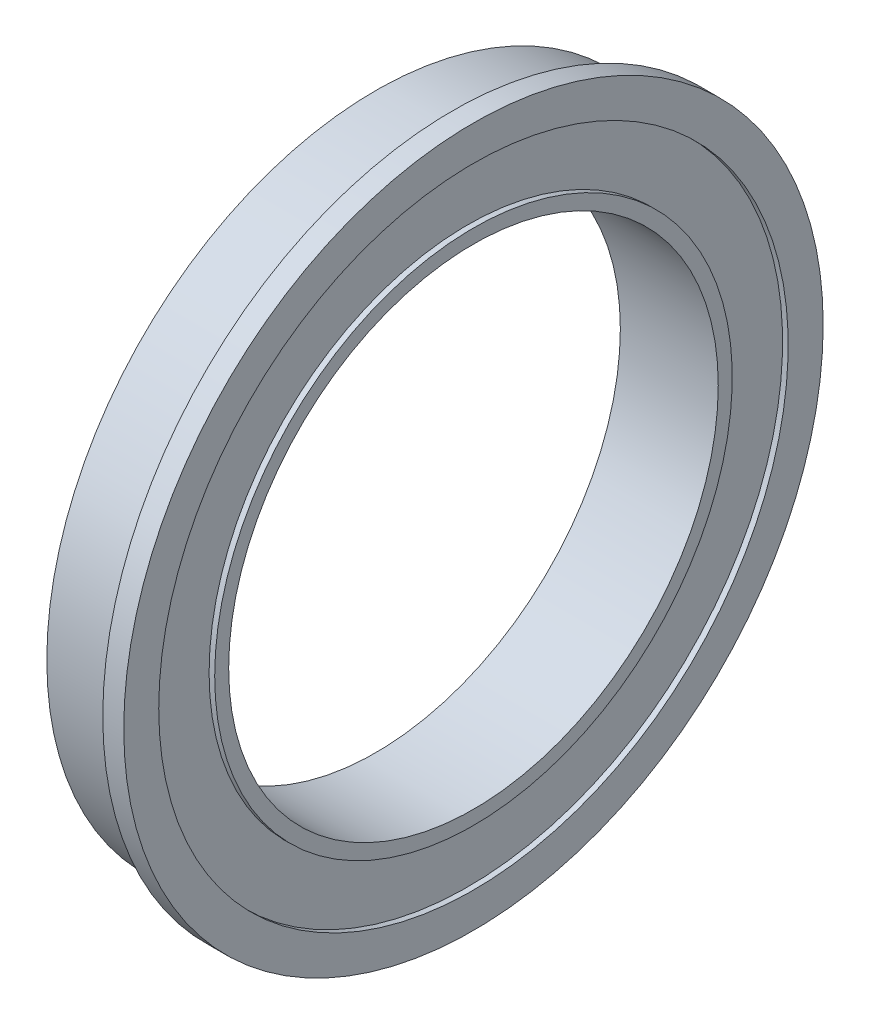
ISO-10303-21;
HEADER;
FILE_DESCRIPTION(('STEP AP214'),'2;1');
FILE_NAME('part.step','',(''),(''),'','','');
FILE_SCHEMA(('AUTOMOTIVE_DESIGN { 1 0 10303 214 1 1 1 1 }'));
ENDSEC;
DATA;
#1=APPLICATION_CONTEXT('core data for automotive mechanical design processes');
#2=APPLICATION_PROTOCOL_DEFINITION('international standard','automotive_design',2000,#1);
#3=PRODUCT_CONTEXT('',#1,'mechanical');
#4=PRODUCT('Part','Part','',(#3));
#5=PRODUCT_RELATED_PRODUCT_CATEGORY('part','',(#4));
#6=PRODUCT_DEFINITION_FORMATION('','',#4);
#7=PRODUCT_DEFINITION_CONTEXT('part definition',#1,'design');
#8=PRODUCT_DEFINITION('design','',#6,#7);
#9=PRODUCT_DEFINITION_SHAPE('','',#8);
#10=(LENGTH_UNIT() NAMED_UNIT(*) SI_UNIT(.MILLI.,.METRE.));
#11=(NAMED_UNIT(*) PLANE_ANGLE_UNIT() SI_UNIT($,.RADIAN.));
#12=(NAMED_UNIT(*) SI_UNIT($,.STERADIAN.) SOLID_ANGLE_UNIT());
#13=UNCERTAINTY_MEASURE_WITH_UNIT(LENGTH_MEASURE(1.E-05),#10,'distance_accuracy_value','');
#14=(GEOMETRIC_REPRESENTATION_CONTEXT(3) GLOBAL_UNCERTAINTY_ASSIGNED_CONTEXT((#13)) GLOBAL_UNIT_ASSIGNED_CONTEXT((#10,
#11,#12)) REPRESENTATION_CONTEXT('',''));
#15=CARTESIAN_POINT('',(0.,0.,0.));
#16=DIRECTION('',(0.,0.,1.));
#17=DIRECTION('',(1.,0.,0.));
#18=AXIS2_PLACEMENT_3D('',#15,#16,#17);
#19=CARTESIAN_POINT('',(5.5,23.5,0.));
#20=DIRECTION('',(1.,0.,0.));
#21=DIRECTION('',(0.,0.,-1.));
#22=AXIS2_PLACEMENT_3D('',#19,#20,#21);
#23=PLANE('',#22);
#24=CARTESIAN_POINT('',(5.5,0.,0.));
#25=DIRECTION('',(-1.,0.,0.));
#26=DIRECTION('',(0.,0.,1.));
#27=AXIS2_PLACEMENT_3D('',#24,#25,#26);
#28=CIRCLE('',#27,23.5);
#29=CARTESIAN_POINT('',(5.5,0.,23.5));
#30=VERTEX_POINT('',#29);
#31=EDGE_CURVE('E86',#30,#30,#28,.T.);
#32=ORIENTED_EDGE('',*,*,#31,.F.);
#33=EDGE_LOOP('',(#32));
#34=FACE_BOUND('',#33,.T.);
#35=CARTESIAN_POINT('',(5.5,0.,0.));
#36=DIRECTION('',(-1.,0.,0.));
#37=DIRECTION('',(0.,0.,1.));
#38=AXIS2_PLACEMENT_3D('',#35,#36,#37);
#39=CIRCLE('',#38,25.);
#40=CARTESIAN_POINT('',(5.5,0.,25.));
#41=VERTEX_POINT('',#40);
#42=EDGE_CURVE('E10',#41,#41,#39,.T.);
#43=ORIENTED_EDGE('',*,*,#42,.T.);
#44=EDGE_LOOP('',(#43));
#45=FACE_BOUND('',#44,.T.);
#46=ADVANCED_FACE('F40',(#34,#45),#23,.F.);
#47=CARTESIAN_POINT('',(0.,0.,0.));
#48=DIRECTION('',(-1.,0.,0.));
#49=DIRECTION('',(0.,0.,1.));
#50=AXIS2_PLACEMENT_3D('',#47,#48,#49);
#51=CYLINDRICAL_SURFACE('',#50,25.);
#52=ORIENTED_EDGE('',*,*,#42,.F.);
#53=EDGE_LOOP('',(#52));
#54=FACE_BOUND('',#53,.T.);
#55=CARTESIAN_POINT('',(7.,0.,0.));
#56=DIRECTION('',(-1.,0.,0.));
#57=DIRECTION('',(0.,0.,1.));
#58=AXIS2_PLACEMENT_3D('',#55,#56,#57);
#59=CIRCLE('',#58,25.);
#60=CARTESIAN_POINT('',(7.,0.,25.));
#61=VERTEX_POINT('',#60);
#62=EDGE_CURVE('E46',#61,#61,#59,.T.);
#63=ORIENTED_EDGE('',*,*,#62,.T.);
#64=EDGE_LOOP('',(#63));
#65=FACE_BOUND('',#64,.T.);
#66=ADVANCED_FACE('F93',(#54,#65),#51,.T.);
#67=CARTESIAN_POINT('',(7.,25.,0.));
#68=DIRECTION('',(-1.,0.,0.));
#69=DIRECTION('',(0.,0.,1.));
#70=AXIS2_PLACEMENT_3D('',#67,#68,#69);
#71=PLANE('',#70);
#72=ORIENTED_EDGE('',*,*,#62,.F.);
#73=EDGE_LOOP('',(#72));
#74=FACE_BOUND('',#73,.T.);
#75=CARTESIAN_POINT('',(7.,0.,0.));
#76=DIRECTION('',(-1.,0.,0.));
#77=DIRECTION('',(0.,0.,1.));
#78=AXIS2_PLACEMENT_3D('',#75,#76,#77);
#79=CIRCLE('',#78,22.5);
#80=CARTESIAN_POINT('',(7.,0.,22.5));
#81=VERTEX_POINT('',#80);
#82=EDGE_CURVE('E50',#81,#81,#79,.T.);
#83=ORIENTED_EDGE('',*,*,#82,.T.);
#84=EDGE_LOOP('',(#83));
#85=FACE_BOUND('',#84,.T.);
#86=ADVANCED_FACE('F97',(#74,#85),#71,.F.);
#87=CARTESIAN_POINT('',(0.,0.,0.));
#88=DIRECTION('',(-1.,0.,0.));
#89=DIRECTION('',(0.,0.,1.));
#90=AXIS2_PLACEMENT_3D('',#87,#88,#89);
#91=CYLINDRICAL_SURFACE('',#90,22.5);
#92=ORIENTED_EDGE('',*,*,#82,.F.);
#93=EDGE_LOOP('',(#92));
#94=FACE_BOUND('',#93,.T.);
#95=CARTESIAN_POINT('',(6.6,0.,0.));
#96=DIRECTION('',(-1.,0.,0.));
#97=DIRECTION('',(0.,0.,1.));
#98=AXIS2_PLACEMENT_3D('',#95,#96,#97);
#99=CIRCLE('',#98,22.5);
#100=CARTESIAN_POINT('',(6.6,0.,22.5));
#101=VERTEX_POINT('',#100);
#102=EDGE_CURVE('E54',#101,#101,#99,.T.);
#103=ORIENTED_EDGE('',*,*,#102,.T.);
#104=EDGE_LOOP('',(#103));
#105=FACE_BOUND('',#104,.T.);
#106=ADVANCED_FACE('F102',(#94,#105),#91,.F.);
#107=CARTESIAN_POINT('',(6.6,22.5,0.));
#108=DIRECTION('',(-1.,0.,0.));
#109=DIRECTION('',(0.,0.,1.));
#110=AXIS2_PLACEMENT_3D('',#107,#108,#109);
#111=PLANE('',#110);
#112=ORIENTED_EDGE('',*,*,#102,.F.);
#113=EDGE_LOOP('',(#112));
#114=FACE_BOUND('',#113,.T.);
#115=CARTESIAN_POINT('',(6.6,0.,0.));
#116=DIRECTION('',(-1.,0.,0.));
#117=DIRECTION('',(0.,0.,1.));
#118=AXIS2_PLACEMENT_3D('',#115,#116,#117);
#119=CIRCLE('',#118,18.5);
#120=CARTESIAN_POINT('',(6.6,0.,18.5));
#121=VERTEX_POINT('',#120);
#122=EDGE_CURVE('E59',#121,#121,#119,.T.);
#123=ORIENTED_EDGE('',*,*,#122,.T.);
#124=EDGE_LOOP('',(#123));
#125=FACE_BOUND('',#124,.T.);
#126=ADVANCED_FACE('F108',(#114,#125),#111,.F.);
#127=CARTESIAN_POINT('',(0.,0.,0.));
#128=DIRECTION('',(-1.,0.,0.));
#129=DIRECTION('',(0.,0.,1.));
#130=AXIS2_PLACEMENT_3D('',#127,#128,#129);
#131=CYLINDRICAL_SURFACE('',#130,18.5);
#132=ORIENTED_EDGE('',*,*,#122,.F.);
#133=EDGE_LOOP('',(#132));
#134=FACE_BOUND('',#133,.T.);
#135=CARTESIAN_POINT('',(7.,0.,0.));
#136=DIRECTION('',(-1.,0.,0.));
#137=DIRECTION('',(0.,0.,1.));
#138=AXIS2_PLACEMENT_3D('',#135,#136,#137);
#139=CIRCLE('',#138,18.5);
#140=CARTESIAN_POINT('',(7.,0.,18.5));
#141=VERTEX_POINT('',#140);
#142=EDGE_CURVE('E62',#141,#141,#139,.T.);
#143=ORIENTED_EDGE('',*,*,#142,.T.);
#144=EDGE_LOOP('',(#143));
#145=FACE_BOUND('',#144,.T.);
#146=ADVANCED_FACE('F112',(#134,#145),#131,.T.);
#147=CARTESIAN_POINT('',(7.,18.5,0.));
#148=DIRECTION('',(-1.,0.,0.));
#149=DIRECTION('',(0.,0.,1.));
#150=AXIS2_PLACEMENT_3D('',#147,#148,#149);
#151=PLANE('',#150);
#152=ORIENTED_EDGE('',*,*,#142,.F.);
#153=EDGE_LOOP('',(#152));
#154=FACE_BOUND('',#153,.T.);
#155=CARTESIAN_POINT('',(7.,0.,0.));
#156=DIRECTION('',(-1.,0.,0.));
#157=DIRECTION('',(0.,0.,1.));
#158=AXIS2_PLACEMENT_3D('',#155,#156,#157);
#159=CIRCLE('',#158,17.5);
#160=CARTESIAN_POINT('',(7.,0.,17.5));
#161=VERTEX_POINT('',#160);
#162=EDGE_CURVE('E65',#161,#161,#159,.T.);
#163=ORIENTED_EDGE('',*,*,#162,.T.);
#164=EDGE_LOOP('',(#163));
#165=FACE_BOUND('',#164,.T.);
#166=ADVANCED_FACE('F116',(#154,#165),#151,.F.);
#167=CARTESIAN_POINT('',(0.,0.,0.));
#168=DIRECTION('',(-1.,0.,0.));
#169=DIRECTION('',(0.,0.,1.));
#170=AXIS2_PLACEMENT_3D('',#167,#168,#169);
#171=CYLINDRICAL_SURFACE('',#170,17.5);
#172=ORIENTED_EDGE('',*,*,#162,.F.);
#173=EDGE_LOOP('',(#172));
#174=FACE_BOUND('',#173,.T.);
#175=CARTESIAN_POINT('',(0.,0.,0.));
#176=DIRECTION('',(-1.,0.,0.));
#177=DIRECTION('',(0.,0.,1.));
#178=AXIS2_PLACEMENT_3D('',#175,#176,#177);
#179=CIRCLE('',#178,17.5);
#180=CARTESIAN_POINT('',(0.,0.,17.5));
#181=VERTEX_POINT('',#180);
#182=EDGE_CURVE('E68',#181,#181,#179,.T.);
#183=ORIENTED_EDGE('',*,*,#182,.T.);
#184=EDGE_LOOP('',(#183));
#185=FACE_BOUND('',#184,.T.);
#186=ADVANCED_FACE('F120',(#174,#185),#171,.F.);
#187=CARTESIAN_POINT('',(0.,17.5,0.));
#188=DIRECTION('',(1.,0.,0.));
#189=DIRECTION('',(0.,0.,-1.));
#190=AXIS2_PLACEMENT_3D('',#187,#188,#189);
#191=PLANE('',#190);
#192=ORIENTED_EDGE('',*,*,#182,.F.);
#193=EDGE_LOOP('',(#192));
#194=FACE_BOUND('',#193,.T.);
#195=CARTESIAN_POINT('',(0.,0.,0.));
#196=DIRECTION('',(-1.,0.,0.));
#197=DIRECTION('',(0.,0.,1.));
#198=AXIS2_PLACEMENT_3D('',#195,#196,#197);
#199=CIRCLE('',#198,18.5);
#200=CARTESIAN_POINT('',(0.,0.,18.5));
#201=VERTEX_POINT('',#200);
#202=EDGE_CURVE('E71',#201,#201,#199,.T.);
#203=ORIENTED_EDGE('',*,*,#202,.T.);
#204=EDGE_LOOP('',(#203));
#205=FACE_BOUND('',#204,.T.);
#206=ADVANCED_FACE('F124',(#194,#205),#191,.F.);
#207=CARTESIAN_POINT('',(0.,0.,0.));
#208=DIRECTION('',(-1.,0.,0.));
#209=DIRECTION('',(0.,0.,1.));
#210=AXIS2_PLACEMENT_3D('',#207,#208,#209);
#211=CYLINDRICAL_SURFACE('',#210,18.5);
#212=ORIENTED_EDGE('',*,*,#202,.F.);
#213=EDGE_LOOP('',(#212));
#214=FACE_BOUND('',#213,.T.);
#215=CARTESIAN_POINT('',(0.4,0.,0.));
#216=DIRECTION('',(-1.,0.,0.));
#217=DIRECTION('',(0.,0.,1.));
#218=AXIS2_PLACEMENT_3D('',#215,#216,#217);
#219=CIRCLE('',#218,18.5);
#220=CARTESIAN_POINT('',(0.4,0.,18.5));
#221=VERTEX_POINT('',#220);
#222=EDGE_CURVE('E74',#221,#221,#219,.T.);
#223=ORIENTED_EDGE('',*,*,#222,.T.);
#224=EDGE_LOOP('',(#223));
#225=FACE_BOUND('',#224,.T.);
#226=ADVANCED_FACE('F128',(#214,#225),#211,.T.);
#227=CARTESIAN_POINT('',(0.4,18.5,0.));
#228=DIRECTION('',(1.,0.,0.));
#229=DIRECTION('',(0.,0.,-1.));
#230=AXIS2_PLACEMENT_3D('',#227,#228,#229);
#231=PLANE('',#230);
#232=ORIENTED_EDGE('',*,*,#222,.F.);
#233=EDGE_LOOP('',(#232));
#234=FACE_BOUND('',#233,.T.);
#235=CARTESIAN_POINT('',(0.4,0.,0.));
#236=DIRECTION('',(-1.,0.,0.));
#237=DIRECTION('',(0.,0.,1.));
#238=AXIS2_PLACEMENT_3D('',#235,#236,#237);
#239=CIRCLE('',#238,22.5);
#240=CARTESIAN_POINT('',(0.4,0.,22.5));
#241=VERTEX_POINT('',#240);
#242=EDGE_CURVE('E77',#241,#241,#239,.T.);
#243=ORIENTED_EDGE('',*,*,#242,.T.);
#244=EDGE_LOOP('',(#243));
#245=FACE_BOUND('',#244,.T.);
#246=ADVANCED_FACE('F132',(#234,#245),#231,.F.);
#247=CARTESIAN_POINT('',(0.,0.,0.));
#248=DIRECTION('',(-1.,0.,0.));
#249=DIRECTION('',(0.,0.,1.));
#250=AXIS2_PLACEMENT_3D('',#247,#248,#249);
#251=CYLINDRICAL_SURFACE('',#250,22.5);
#252=ORIENTED_EDGE('',*,*,#242,.F.);
#253=EDGE_LOOP('',(#252));
#254=FACE_BOUND('',#253,.T.);
#255=CARTESIAN_POINT('',(0.,0.,0.));
#256=DIRECTION('',(-1.,0.,0.));
#257=DIRECTION('',(0.,0.,1.));
#258=AXIS2_PLACEMENT_3D('',#255,#256,#257);
#259=CIRCLE('',#258,22.5);
#260=CARTESIAN_POINT('',(0.,0.,22.5));
#261=VERTEX_POINT('',#260);
#262=EDGE_CURVE('E80',#261,#261,#259,.T.);
#263=ORIENTED_EDGE('',*,*,#262,.T.);
#264=EDGE_LOOP('',(#263));
#265=FACE_BOUND('',#264,.T.);
#266=ADVANCED_FACE('F136',(#254,#265),#251,.F.);
#267=CARTESIAN_POINT('',(0.,22.5,0.));
#268=DIRECTION('',(1.,0.,0.));
#269=DIRECTION('',(0.,0.,-1.));
#270=AXIS2_PLACEMENT_3D('',#267,#268,#269);
#271=PLANE('',#270);
#272=ORIENTED_EDGE('',*,*,#262,.F.);
#273=EDGE_LOOP('',(#272));
#274=FACE_BOUND('',#273,.T.);
#275=CARTESIAN_POINT('',(0.,0.,0.));
#276=DIRECTION('',(-1.,0.,0.));
#277=DIRECTION('',(0.,0.,1.));
#278=AXIS2_PLACEMENT_3D('',#275,#276,#277);
#279=CIRCLE('',#278,23.5);
#280=CARTESIAN_POINT('',(0.,0.,23.5));
#281=VERTEX_POINT('',#280);
#282=EDGE_CURVE('E83',#281,#281,#279,.T.);
#283=ORIENTED_EDGE('',*,*,#282,.T.);
#284=EDGE_LOOP('',(#283));
#285=FACE_BOUND('',#284,.T.);
#286=ADVANCED_FACE('F140',(#274,#285),#271,.F.);
#287=CARTESIAN_POINT('',(0.,0.,0.));
#288=DIRECTION('',(-1.,0.,0.));
#289=DIRECTION('',(0.,0.,1.));
#290=AXIS2_PLACEMENT_3D('',#287,#288,#289);
#291=CYLINDRICAL_SURFACE('',#290,23.5);
#292=ORIENTED_EDGE('',*,*,#282,.F.);
#293=EDGE_LOOP('',(#292));
#294=FACE_BOUND('',#293,.T.);
#295=ORIENTED_EDGE('',*,*,#31,.T.);
#296=EDGE_LOOP('',(#295));
#297=FACE_BOUND('',#296,.T.);
#298=ADVANCED_FACE('F90',(#294,#297),#291,.T.);
#299=CLOSED_SHELL('',(#46,#66,#86,#106,#126,#146,#166,#186,#206,#226,#246,#266,#286,#298));
#300=MANIFOLD_SOLID_BREP('B2',#299);
#301=ADVANCED_BREP_SHAPE_REPRESENTATION('',(#18,#300),#14);
#302=SHAPE_DEFINITION_REPRESENTATION(#9,#301);
ENDSEC;
END-ISO-10303-21;
